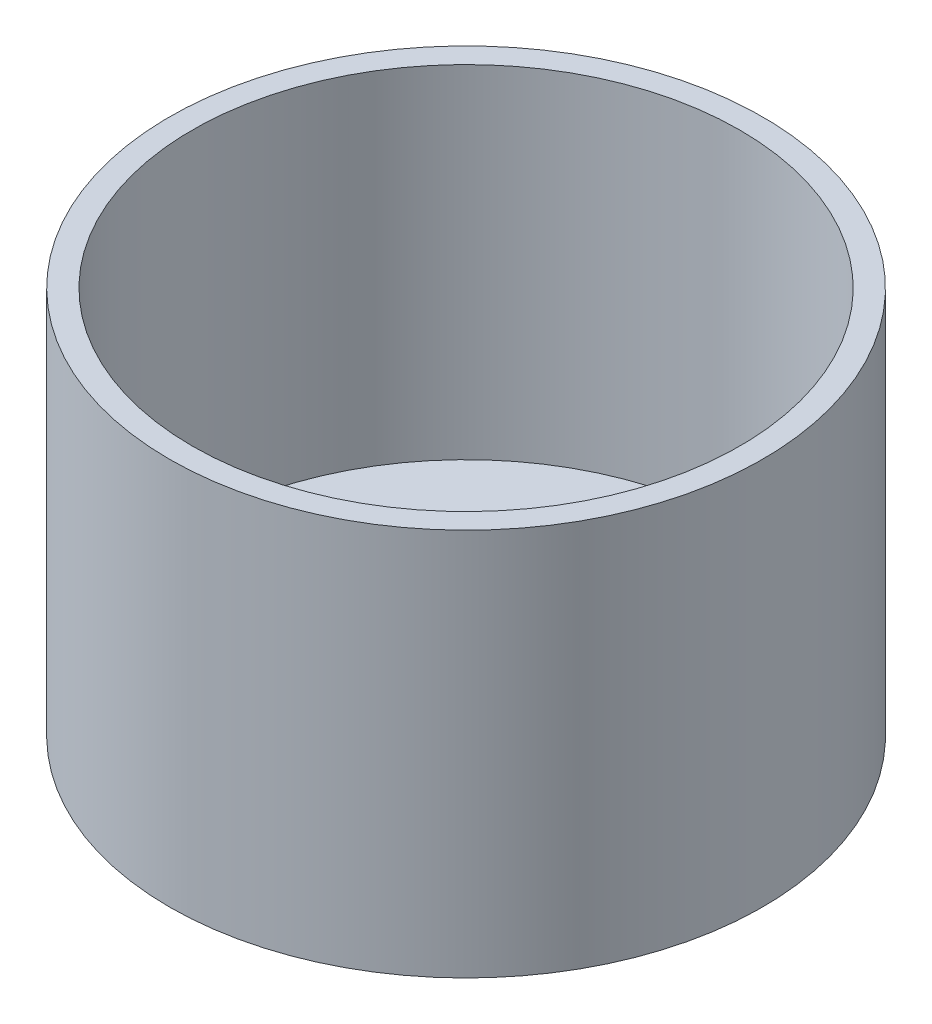
ISO-10303-21;
HEADER;
FILE_DESCRIPTION(('STEP AP214'),'2;1');
FILE_NAME('part.step','',(''),(''),'','','');
FILE_SCHEMA(('AUTOMOTIVE_DESIGN { 1 0 10303 214 1 1 1 1 }'));
ENDSEC;
DATA;
#1=APPLICATION_CONTEXT('core data for automotive mechanical design processes');
#2=APPLICATION_PROTOCOL_DEFINITION('international standard','automotive_design',2000,#1);
#3=PRODUCT_CONTEXT('',#1,'mechanical');
#4=PRODUCT('Part','Part','',(#3));
#5=PRODUCT_RELATED_PRODUCT_CATEGORY('part','',(#4));
#6=PRODUCT_DEFINITION_FORMATION('','',#4);
#7=PRODUCT_DEFINITION_CONTEXT('part definition',#1,'design');
#8=PRODUCT_DEFINITION('design','',#6,#7);
#9=PRODUCT_DEFINITION_SHAPE('','',#8);
#10=(LENGTH_UNIT() NAMED_UNIT(*) SI_UNIT(.MILLI.,.METRE.));
#11=(NAMED_UNIT(*) PLANE_ANGLE_UNIT() SI_UNIT($,.RADIAN.));
#12=(NAMED_UNIT(*) SI_UNIT($,.STERADIAN.) SOLID_ANGLE_UNIT());
#13=UNCERTAINTY_MEASURE_WITH_UNIT(LENGTH_MEASURE(1.E-05),#10,'distance_accuracy_value','');
#14=(GEOMETRIC_REPRESENTATION_CONTEXT(3) GLOBAL_UNCERTAINTY_ASSIGNED_CONTEXT((#13)) GLOBAL_UNIT_ASSIGNED_CONTEXT((#10,
#11,#12)) REPRESENTATION_CONTEXT('',''));
#15=CARTESIAN_POINT('',(0.,0.,0.));
#16=DIRECTION('',(0.,0.,1.));
#17=DIRECTION('',(1.,0.,0.));
#18=AXIS2_PLACEMENT_3D('',#15,#16,#17);
#19=CARTESIAN_POINT('',(0.,2.,0.));
#20=DIRECTION('',(0.,-1.,0.));
#21=DIRECTION('',(0.,0.,-1.));
#22=AXIS2_PLACEMENT_3D('',#19,#20,#21);
#23=CYLINDRICAL_SURFACE('',#22,13.);
#24=CARTESIAN_POINT('',(0.,0.,0.));
#25=DIRECTION('',(0.,1.,0.));
#26=DIRECTION('',(0.,0.,1.));
#27=AXIS2_PLACEMENT_3D('',#24,#25,#26);
#28=CIRCLE('',#27,13.);
#29=CARTESIAN_POINT('',(0.,0.,13.));
#30=VERTEX_POINT('',#29);
#31=EDGE_CURVE('E44',#30,#30,#28,.T.);
#32=ORIENTED_EDGE('',*,*,#31,.T.);
#33=EDGE_LOOP('',(#32));
#34=FACE_BOUND('',#33,.T.);
#35=CARTESIAN_POINT('',(0.,17.,0.));
#36=DIRECTION('',(0.,1.,0.));
#37=DIRECTION('',(0.,0.,1.));
#38=AXIS2_PLACEMENT_3D('',#35,#36,#37);
#39=CIRCLE('',#38,13.);
#40=CARTESIAN_POINT('',(0.,17.,13.));
#41=VERTEX_POINT('',#40);
#42=EDGE_CURVE('E48',#41,#41,#39,.T.);
#43=ORIENTED_EDGE('',*,*,#42,.F.);
#44=EDGE_LOOP('',(#43));
#45=FACE_BOUND('',#44,.T.);
#46=ADVANCED_FACE('F37',(#34,#45),#23,.T.);
#47=CARTESIAN_POINT('',(0.,0.,0.));
#48=DIRECTION('',(0.,1.,0.));
#49=DIRECTION('',(0.,0.,1.));
#50=AXIS2_PLACEMENT_3D('',#47,#48,#49);
#51=PLANE('',#50);
#52=CARTESIAN_POINT('',(0.,0.,0.));
#53=DIRECTION('',(0.,-1.,0.));
#54=DIRECTION('',(0.,0.,-1.));
#55=AXIS2_PLACEMENT_3D('',#52,#53,#54);
#56=CIRCLE('',#55,5.);
#57=CARTESIAN_POINT('',(0.,0.,-5.));
#58=VERTEX_POINT('',#57);
#59=EDGE_CURVE('E56',#58,#58,#56,.T.);
#60=ORIENTED_EDGE('',*,*,#59,.F.);
#61=EDGE_LOOP('',(#60));
#62=FACE_BOUND('',#61,.T.);
#63=ORIENTED_EDGE('',*,*,#31,.F.);
#64=EDGE_LOOP('',(#63));
#65=FACE_BOUND('',#64,.T.);
#66=ADVANCED_FACE('F81',(#62,#65),#51,.F.);
#67=CARTESIAN_POINT('',(0.,17.,0.));
#68=DIRECTION('',(0.,1.,0.));
#69=DIRECTION('',(0.,0.,1.));
#70=AXIS2_PLACEMENT_3D('',#67,#68,#69);
#71=PLANE('',#70);
#72=ORIENTED_EDGE('',*,*,#42,.T.);
#73=EDGE_LOOP('',(#72));
#74=FACE_BOUND('',#73,.T.);
#75=CARTESIAN_POINT('',(0.,17.,0.));
#76=DIRECTION('',(0.,1.,0.));
#77=DIRECTION('',(0.,0.,1.));
#78=AXIS2_PLACEMENT_3D('',#75,#76,#77);
#79=CIRCLE('',#78,12.);
#80=CARTESIAN_POINT('',(0.,17.,12.));
#81=VERTEX_POINT('',#80);
#82=EDGE_CURVE('E53',#81,#81,#79,.T.);
#83=ORIENTED_EDGE('',*,*,#82,.F.);
#84=EDGE_LOOP('',(#83));
#85=FACE_BOUND('',#84,.T.);
#86=ADVANCED_FACE('F76',(#74,#85),#71,.T.);
#87=CARTESIAN_POINT('',(0.,17.,0.));
#88=DIRECTION('',(0.,-1.,0.));
#89=DIRECTION('',(0.,0.,-1.));
#90=AXIS2_PLACEMENT_3D('',#87,#88,#89);
#91=CYLINDRICAL_SURFACE('',#90,12.);
#92=ORIENTED_EDGE('',*,*,#82,.T.);
#93=EDGE_LOOP('',(#92));
#94=FACE_BOUND('',#93,.T.);
#95=CARTESIAN_POINT('',(0.,2.,0.));
#96=DIRECTION('',(0.,1.,0.));
#97=DIRECTION('',(0.,0.,1.));
#98=AXIS2_PLACEMENT_3D('',#95,#96,#97);
#99=CIRCLE('',#98,12.);
#100=CARTESIAN_POINT('',(0.,2.,12.));
#101=VERTEX_POINT('',#100);
#102=EDGE_CURVE('E10',#101,#101,#99,.F.);
#103=ORIENTED_EDGE('',*,*,#102,.T.);
#104=EDGE_LOOP('',(#103));
#105=FACE_BOUND('',#104,.T.);
#106=ADVANCED_FACE('F68',(#94,#105),#91,.F.);
#107=CARTESIAN_POINT('',(0.,2.,0.));
#108=DIRECTION('',(0.,1.,0.));
#109=DIRECTION('',(0.,0.,1.));
#110=AXIS2_PLACEMENT_3D('',#107,#108,#109);
#111=PLANE('',#110);
#112=CARTESIAN_POINT('',(0.,2.,0.));
#113=DIRECTION('',(0.,1.,0.));
#114=DIRECTION('',(0.,0.,1.));
#115=AXIS2_PLACEMENT_3D('',#112,#113,#114);
#116=CIRCLE('',#115,5.);
#117=CARTESIAN_POINT('',(0.,2.,5.));
#118=VERTEX_POINT('',#117);
#119=EDGE_CURVE('E40',#118,#118,#116,.T.);
#120=ORIENTED_EDGE('',*,*,#119,.F.);
#121=EDGE_LOOP('',(#120));
#122=FACE_BOUND('',#121,.T.);
#123=ORIENTED_EDGE('',*,*,#102,.F.);
#124=EDGE_LOOP('',(#123));
#125=FACE_BOUND('',#124,.T.);
#126=ADVANCED_FACE('F65',(#122,#125),#111,.T.);
#127=CARTESIAN_POINT('',(0.,15.,0.));
#128=DIRECTION('',(0.,-1.,0.));
#129=DIRECTION('',(0.,0.,-1.));
#130=AXIS2_PLACEMENT_3D('',#127,#128,#129);
#131=CYLINDRICAL_SURFACE('',#130,5.);
#132=ORIENTED_EDGE('',*,*,#119,.T.);
#133=EDGE_LOOP('',(#132));
#134=FACE_BOUND('',#133,.T.);
#135=ORIENTED_EDGE('',*,*,#59,.T.);
#136=EDGE_LOOP('',(#135));
#137=FACE_BOUND('',#136,.T.);
#138=ADVANCED_FACE('F63',(#134,#137),#131,.F.);
#139=CLOSED_SHELL('',(#46,#66,#86,#106,#126,#138));
#140=MANIFOLD_SOLID_BREP('B2',#139);
#141=ADVANCED_BREP_SHAPE_REPRESENTATION('',(#18,#140),#14);
#142=SHAPE_DEFINITION_REPRESENTATION(#9,#141);
ENDSEC;
END-ISO-10303-21;
